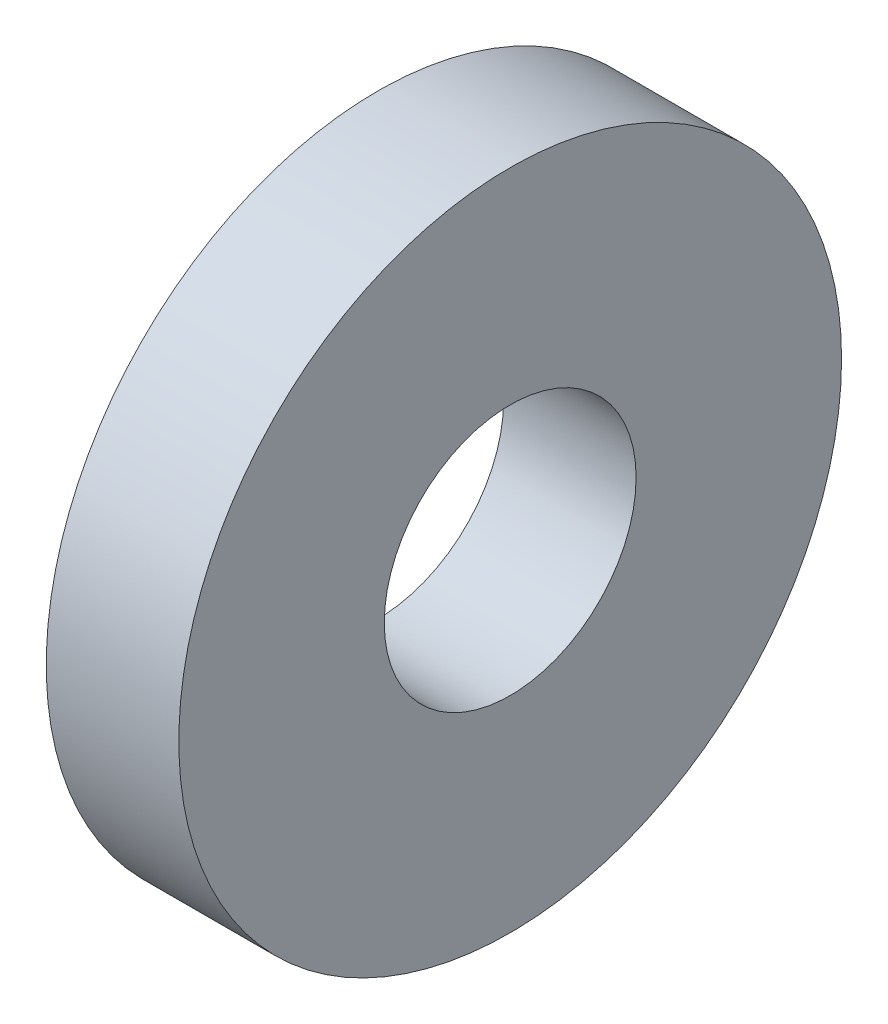
ISO-10303-21;
HEADER;
FILE_DESCRIPTION(('STEP AP214'),'2;1');
FILE_NAME('part.step','',(''),(''),'','','');
FILE_SCHEMA(('AUTOMOTIVE_DESIGN { 1 0 10303 214 1 1 1 1 }'));
ENDSEC;
DATA;
#1=APPLICATION_CONTEXT('core data for automotive mechanical design processes');
#2=APPLICATION_PROTOCOL_DEFINITION('international standard','automotive_design',2000,#1);
#3=PRODUCT_CONTEXT('',#1,'mechanical');
#4=PRODUCT('Part','Part','',(#3));
#5=PRODUCT_RELATED_PRODUCT_CATEGORY('part','',(#4));
#6=PRODUCT_DEFINITION_FORMATION('','',#4);
#7=PRODUCT_DEFINITION_CONTEXT('part definition',#1,'design');
#8=PRODUCT_DEFINITION('design','',#6,#7);
#9=PRODUCT_DEFINITION_SHAPE('','',#8);
#10=(LENGTH_UNIT() NAMED_UNIT(*) SI_UNIT(.MILLI.,.METRE.));
#11=(NAMED_UNIT(*) PLANE_ANGLE_UNIT() SI_UNIT($,.RADIAN.));
#12=(NAMED_UNIT(*) SI_UNIT($,.STERADIAN.) SOLID_ANGLE_UNIT());
#13=UNCERTAINTY_MEASURE_WITH_UNIT(LENGTH_MEASURE(1.E-05),#10,'distance_accuracy_value','');
#14=(GEOMETRIC_REPRESENTATION_CONTEXT(3) GLOBAL_UNCERTAINTY_ASSIGNED_CONTEXT((#13)) GLOBAL_UNIT_ASSIGNED_CONTEXT((#10,
#11,#12)) REPRESENTATION_CONTEXT('',''));
#15=CARTESIAN_POINT('',(0.,0.,0.));
#16=DIRECTION('',(0.,0.,1.));
#17=DIRECTION('',(1.,0.,0.));
#18=AXIS2_PLACEMENT_3D('',#15,#16,#17);
#19=CARTESIAN_POINT('',(1.,0.,0.));
#20=DIRECTION('',(1.,0.,0.));
#21=DIRECTION('',(0.,0.,-1.));
#22=AXIS2_PLACEMENT_3D('',#19,#20,#21);
#23=PLANE('',#22);
#24=CARTESIAN_POINT('',(1.,0.,0.));
#25=DIRECTION('',(1.,0.,0.));
#26=DIRECTION('',(0.,0.,-1.));
#27=AXIS2_PLACEMENT_3D('',#24,#25,#26);
#28=CIRCLE('',#27,2.5);
#29=CARTESIAN_POINT('',(1.,0.,-2.5));
#30=VERTEX_POINT('',#29);
#31=EDGE_CURVE('E10',#30,#30,#28,.T.);
#32=ORIENTED_EDGE('',*,*,#31,.T.);
#33=EDGE_LOOP('',(#32));
#34=FACE_BOUND('',#33,.T.);
#35=CARTESIAN_POINT('',(1.,0.,0.));
#36=DIRECTION('',(1.,0.,0.));
#37=DIRECTION('',(0.,0.,-1.));
#38=AXIS2_PLACEMENT_3D('',#35,#36,#37);
#39=CIRCLE('',#38,0.95);
#40=CARTESIAN_POINT('',(1.,0.,-0.95));
#41=VERTEX_POINT('',#40);
#42=EDGE_CURVE('E42',#41,#41,#39,.T.);
#43=ORIENTED_EDGE('',*,*,#42,.F.);
#44=EDGE_LOOP('',(#43));
#45=FACE_BOUND('',#44,.T.);
#46=ADVANCED_FACE('F31',(#34,#45),#23,.T.);
#47=CARTESIAN_POINT('',(0.,0.,0.));
#48=DIRECTION('',(1.,0.,0.));
#49=DIRECTION('',(0.,0.,-1.));
#50=AXIS2_PLACEMENT_3D('',#47,#48,#49);
#51=PLANE('',#50);
#52=CARTESIAN_POINT('',(0.,0.,0.));
#53=DIRECTION('',(1.,0.,0.));
#54=DIRECTION('',(0.,0.,-1.));
#55=AXIS2_PLACEMENT_3D('',#52,#53,#54);
#56=CIRCLE('',#55,2.5);
#57=CARTESIAN_POINT('',(0.,0.,-2.5));
#58=VERTEX_POINT('',#57);
#59=EDGE_CURVE('E35',#58,#58,#56,.T.);
#60=ORIENTED_EDGE('',*,*,#59,.F.);
#61=EDGE_LOOP('',(#60));
#62=FACE_BOUND('',#61,.T.);
#63=CARTESIAN_POINT('',(0.,0.,0.));
#64=DIRECTION('',(1.,0.,0.));
#65=DIRECTION('',(0.,0.,-1.));
#66=AXIS2_PLACEMENT_3D('',#63,#64,#65);
#67=CIRCLE('',#66,0.95);
#68=CARTESIAN_POINT('',(0.,0.,-0.95));
#69=VERTEX_POINT('',#68);
#70=EDGE_CURVE('E44',#69,#69,#67,.T.);
#71=ORIENTED_EDGE('',*,*,#70,.T.);
#72=EDGE_LOOP('',(#71));
#73=FACE_BOUND('',#72,.T.);
#74=ADVANCED_FACE('F54',(#62,#73),#51,.F.);
#75=CARTESIAN_POINT('',(1.,0.,0.));
#76=DIRECTION('',(-1.,0.,0.));
#77=DIRECTION('',(0.,0.,1.));
#78=AXIS2_PLACEMENT_3D('',#75,#76,#77);
#79=CYLINDRICAL_SURFACE('',#78,2.5);
#80=ORIENTED_EDGE('',*,*,#31,.F.);
#81=EDGE_LOOP('',(#80));
#82=FACE_BOUND('',#81,.T.);
#83=ORIENTED_EDGE('',*,*,#59,.T.);
#84=EDGE_LOOP('',(#83));
#85=FACE_BOUND('',#84,.T.);
#86=ADVANCED_FACE('F33',(#82,#85),#79,.T.);
#87=CARTESIAN_POINT('',(1.,0.,0.));
#88=DIRECTION('',(-1.,0.,0.));
#89=DIRECTION('',(0.,0.,1.));
#90=AXIS2_PLACEMENT_3D('',#87,#88,#89);
#91=CYLINDRICAL_SURFACE('',#90,0.95);
#92=ORIENTED_EDGE('',*,*,#42,.T.);
#93=EDGE_LOOP('',(#92));
#94=FACE_BOUND('',#93,.T.);
#95=ORIENTED_EDGE('',*,*,#70,.F.);
#96=EDGE_LOOP('',(#95));
#97=FACE_BOUND('',#96,.T.);
#98=ADVANCED_FACE('F50',(#94,#97),#91,.F.);
#99=CLOSED_SHELL('',(#46,#74,#86,#98));
#100=MANIFOLD_SOLID_BREP('B2',#99);
#101=ADVANCED_BREP_SHAPE_REPRESENTATION('',(#18,#100),#14);
#102=SHAPE_DEFINITION_REPRESENTATION(#9,#101);
ENDSEC;
END-ISO-10303-21;
